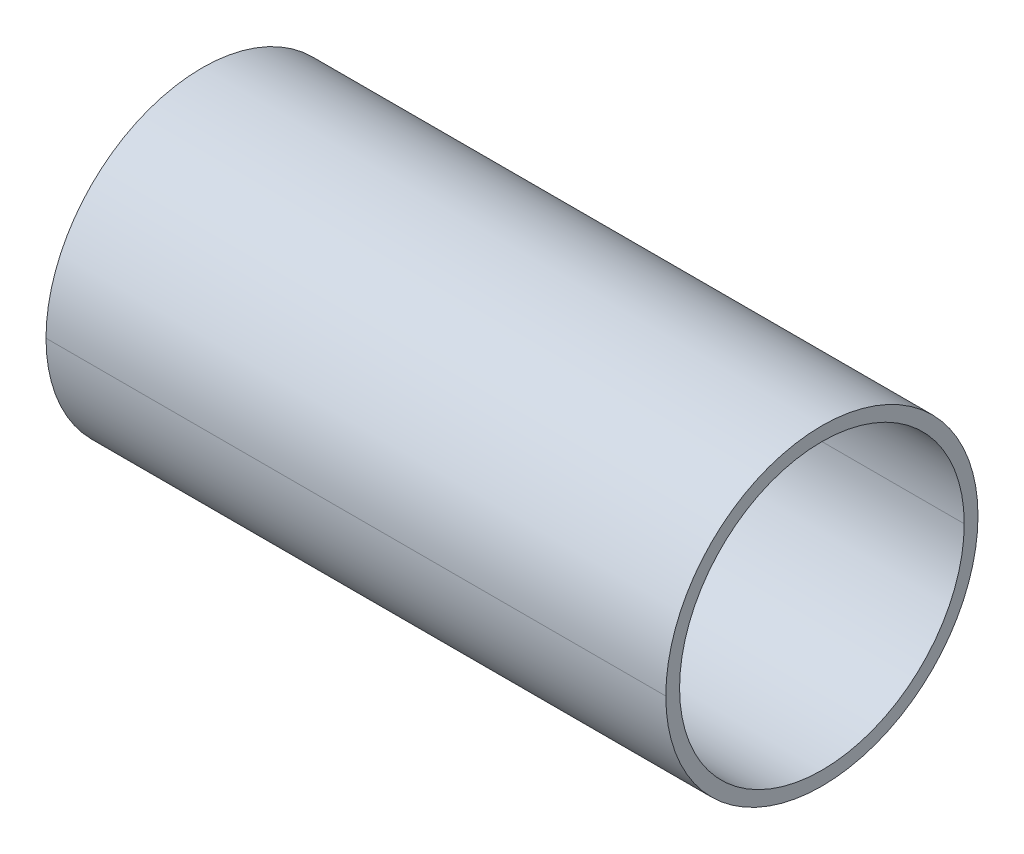
ISO-10303-21;
HEADER;
FILE_DESCRIPTION(('STEP AP214'),'2;1');
FILE_NAME('part.step','',(''),(''),'','','');
FILE_SCHEMA(('AUTOMOTIVE_DESIGN { 1 0 10303 214 1 1 1 1 }'));
ENDSEC;
DATA;
#1=APPLICATION_CONTEXT('core data for automotive mechanical design processes');
#2=APPLICATION_PROTOCOL_DEFINITION('international standard','automotive_design',2000,#1);
#3=PRODUCT_CONTEXT('',#1,'mechanical');
#4=PRODUCT('Part','Part','',(#3));
#5=PRODUCT_RELATED_PRODUCT_CATEGORY('part','',(#4));
#6=PRODUCT_DEFINITION_FORMATION('','',#4);
#7=PRODUCT_DEFINITION_CONTEXT('part definition',#1,'design');
#8=PRODUCT_DEFINITION('design','',#6,#7);
#9=PRODUCT_DEFINITION_SHAPE('','',#8);
#10=(LENGTH_UNIT() NAMED_UNIT(*) SI_UNIT(.MILLI.,.METRE.));
#11=(NAMED_UNIT(*) PLANE_ANGLE_UNIT() SI_UNIT($,.RADIAN.));
#12=(NAMED_UNIT(*) SI_UNIT($,.STERADIAN.) SOLID_ANGLE_UNIT());
#13=UNCERTAINTY_MEASURE_WITH_UNIT(LENGTH_MEASURE(1.E-05),#10,'distance_accuracy_value','');
#14=(GEOMETRIC_REPRESENTATION_CONTEXT(3) GLOBAL_UNCERTAINTY_ASSIGNED_CONTEXT((#13)) GLOBAL_UNIT_ASSIGNED_CONTEXT((#10,
#11,#12)) REPRESENTATION_CONTEXT('',''));
#15=CARTESIAN_POINT('',(0.,0.,0.));
#16=DIRECTION('',(0.,0.,1.));
#17=DIRECTION('',(1.,0.,0.));
#18=AXIS2_PLACEMENT_3D('',#15,#16,#17);
#19=CARTESIAN_POINT('',(-125.048400264241,0.,0.));
#20=DIRECTION('',(-1.,0.,0.));
#21=DIRECTION('',(0.,0.,1.));
#22=AXIS2_PLACEMENT_3D('',#19,#20,#21);
#23=CYLINDRICAL_SURFACE('',#22,34.);
#24=DIRECTION('',(-1.,0.,0.));
#25=VECTOR('',#24,1.);
#26=CARTESIAN_POINT('',(-125.048400264241,0.,-34.));
#27=LINE('',#26,#25);
#28=CARTESIAN_POINT('',(67.5,0.,-34.));
#29=VERTEX_POINT('',#28);
#30=CARTESIAN_POINT('',(-67.5,0.,-34.));
#31=VERTEX_POINT('',#30);
#32=EDGE_CURVE('E113',#29,#31,#27,.T.);
#33=ORIENTED_EDGE('',*,*,#32,.F.);
#34=CARTESIAN_POINT('',(67.5,0.,0.));
#35=DIRECTION('',(-1.,0.,0.));
#36=DIRECTION('',(0.,0.,1.));
#37=AXIS2_PLACEMENT_3D('',#34,#35,#36);
#38=CIRCLE('',#37,34.);
#39=CARTESIAN_POINT('',(67.5,0.,34.));
#40=VERTEX_POINT('',#39);
#41=EDGE_CURVE('E11',#29,#40,#38,.T.);
#42=ORIENTED_EDGE('',*,*,#41,.T.);
#43=DIRECTION('',(-1.,0.,0.));
#44=VECTOR('',#43,1.);
#45=CARTESIAN_POINT('',(-125.048400264241,0.,34.));
#46=LINE('',#45,#44);
#47=CARTESIAN_POINT('',(-67.5,0.,34.));
#48=VERTEX_POINT('',#47);
#49=EDGE_CURVE('E99',#40,#48,#46,.T.);
#50=ORIENTED_EDGE('',*,*,#49,.T.);
#51=CARTESIAN_POINT('',(-67.5,0.,0.));
#52=DIRECTION('',(-1.,0.,0.));
#53=DIRECTION('',(0.,0.,1.));
#54=AXIS2_PLACEMENT_3D('',#51,#52,#53);
#55=CIRCLE('',#54,34.);
#56=EDGE_CURVE('E65',#31,#48,#55,.T.);
#57=ORIENTED_EDGE('',*,*,#56,.F.);
#58=EDGE_LOOP('',(#33,#42,#50,#57));
#59=FACE_BOUND('',#58,.T.);
#60=ADVANCED_FACE('F16',(#59),#23,.T.);
#61=CARTESIAN_POINT('',(67.5,34.,0.));
#62=DIRECTION('',(-1.,0.,0.));
#63=DIRECTION('',(0.,0.,1.));
#64=AXIS2_PLACEMENT_3D('',#61,#62,#63);
#65=PLANE('',#64);
#66=CARTESIAN_POINT('',(67.5,0.,0.));
#67=DIRECTION('',(-1.,0.,0.));
#68=DIRECTION('',(0.,0.,1.));
#69=AXIS2_PLACEMENT_3D('',#66,#67,#68);
#70=CIRCLE('',#69,31.);
#71=CARTESIAN_POINT('',(67.5,0.,31.));
#72=VERTEX_POINT('',#71);
#73=CARTESIAN_POINT('',(67.5,0.,-31.));
#74=VERTEX_POINT('',#73);
#75=EDGE_CURVE('E26',#72,#74,#70,.T.);
#76=ORIENTED_EDGE('',*,*,#75,.T.);
#77=CARTESIAN_POINT('',(67.5,0.,0.));
#78=DIRECTION('',(-1.,0.,0.));
#79=DIRECTION('',(0.,0.,1.));
#80=AXIS2_PLACEMENT_3D('',#77,#78,#79);
#81=CIRCLE('',#80,31.);
#82=EDGE_CURVE('E20',#74,#72,#81,.T.);
#83=ORIENTED_EDGE('',*,*,#82,.T.);
#84=EDGE_LOOP('',(#76,#83));
#85=FACE_BOUND('',#84,.T.);
#86=CARTESIAN_POINT('',(67.5,0.,0.));
#87=DIRECTION('',(-1.,0.,0.));
#88=DIRECTION('',(0.,0.,1.));
#89=AXIS2_PLACEMENT_3D('',#86,#87,#88);
#90=CIRCLE('',#89,34.);
#91=EDGE_CURVE('E117',#40,#29,#90,.T.);
#92=ORIENTED_EDGE('',*,*,#91,.F.);
#93=ORIENTED_EDGE('',*,*,#41,.F.);
#94=EDGE_LOOP('',(#92,#93));
#95=FACE_BOUND('',#94,.T.);
#96=ADVANCED_FACE('F84',(#85,#95),#65,.F.);
#97=CARTESIAN_POINT('',(-125.048400264241,0.,0.));
#98=DIRECTION('',(-1.,0.,0.));
#99=DIRECTION('',(0.,0.,1.));
#100=AXIS2_PLACEMENT_3D('',#97,#98,#99);
#101=CYLINDRICAL_SURFACE('',#100,31.);
#102=DIRECTION('',(-1.,0.,0.));
#103=VECTOR('',#102,1.);
#104=CARTESIAN_POINT('',(-125.048400264241,0.,-31.));
#105=LINE('',#104,#103);
#106=CARTESIAN_POINT('',(-67.5,0.,-31.));
#107=VERTEX_POINT('',#106);
#108=EDGE_CURVE('E89',#74,#107,#105,.T.);
#109=ORIENTED_EDGE('',*,*,#108,.F.);
#110=ORIENTED_EDGE('',*,*,#75,.F.);
#111=DIRECTION('',(-1.,0.,0.));
#112=VECTOR('',#111,1.);
#113=CARTESIAN_POINT('',(-125.048400264241,0.,31.));
#114=LINE('',#113,#112);
#115=CARTESIAN_POINT('',(-67.5,0.,31.));
#116=VERTEX_POINT('',#115);
#117=EDGE_CURVE('E97',#72,#116,#114,.T.);
#118=ORIENTED_EDGE('',*,*,#117,.T.);
#119=CARTESIAN_POINT('',(-67.5,0.,0.));
#120=DIRECTION('',(-1.,0.,0.));
#121=DIRECTION('',(0.,0.,1.));
#122=AXIS2_PLACEMENT_3D('',#119,#120,#121);
#123=CIRCLE('',#122,31.);
#124=EDGE_CURVE('E39',#116,#107,#123,.T.);
#125=ORIENTED_EDGE('',*,*,#124,.T.);
#126=EDGE_LOOP('',(#109,#110,#118,#125));
#127=FACE_BOUND('',#126,.T.);
#128=ADVANCED_FACE('F90',(#127),#101,.F.);
#129=CARTESIAN_POINT('',(-67.5,34.,0.));
#130=DIRECTION('',(1.,0.,0.));
#131=DIRECTION('',(0.,1.,0.));
#132=AXIS2_PLACEMENT_3D('',#129,#130,#131);
#133=PLANE('',#132);
#134=ORIENTED_EDGE('',*,*,#124,.F.);
#135=CARTESIAN_POINT('',(-67.5,0.,0.));
#136=DIRECTION('',(-1.,0.,0.));
#137=DIRECTION('',(0.,0.,1.));
#138=AXIS2_PLACEMENT_3D('',#135,#136,#137);
#139=CIRCLE('',#138,31.);
#140=EDGE_CURVE('E94',#107,#116,#139,.T.);
#141=ORIENTED_EDGE('',*,*,#140,.F.);
#142=EDGE_LOOP('',(#134,#141));
#143=FACE_BOUND('',#142,.T.);
#144=CARTESIAN_POINT('',(-67.5,0.,0.));
#145=DIRECTION('',(-1.,0.,0.));
#146=DIRECTION('',(0.,0.,1.));
#147=AXIS2_PLACEMENT_3D('',#144,#145,#146);
#148=CIRCLE('',#147,34.);
#149=EDGE_CURVE('E104',#48,#31,#148,.T.);
#150=ORIENTED_EDGE('',*,*,#149,.T.);
#151=ORIENTED_EDGE('',*,*,#56,.T.);
#152=EDGE_LOOP('',(#150,#151));
#153=FACE_BOUND('',#152,.T.);
#154=ADVANCED_FACE('F138',(#143,#153),#133,.F.);
#155=CARTESIAN_POINT('',(-125.048400264241,0.,0.));
#156=DIRECTION('',(-1.,0.,0.));
#157=DIRECTION('',(0.,0.,1.));
#158=AXIS2_PLACEMENT_3D('',#155,#156,#157);
#159=CYLINDRICAL_SURFACE('',#158,31.);
#160=ORIENTED_EDGE('',*,*,#82,.F.);
#161=ORIENTED_EDGE('',*,*,#108,.T.);
#162=ORIENTED_EDGE('',*,*,#140,.T.);
#163=ORIENTED_EDGE('',*,*,#117,.F.);
#164=EDGE_LOOP('',(#160,#161,#162,#163));
#165=FACE_BOUND('',#164,.T.);
#166=ADVANCED_FACE('F96',(#165),#159,.F.);
#167=CARTESIAN_POINT('',(-125.048400264241,0.,0.));
#168=DIRECTION('',(-1.,0.,0.));
#169=DIRECTION('',(0.,0.,1.));
#170=AXIS2_PLACEMENT_3D('',#167,#168,#169);
#171=CYLINDRICAL_SURFACE('',#170,34.);
#172=ORIENTED_EDGE('',*,*,#91,.T.);
#173=ORIENTED_EDGE('',*,*,#32,.T.);
#174=ORIENTED_EDGE('',*,*,#149,.F.);
#175=ORIENTED_EDGE('',*,*,#49,.F.);
#176=EDGE_LOOP('',(#172,#173,#174,#175));
#177=FACE_BOUND('',#176,.T.);
#178=ADVANCED_FACE('F18',(#177),#171,.T.);
#179=CLOSED_SHELL('',(#60,#96,#128,#154,#166,#178));
#180=MANIFOLD_SOLID_BREP('B1',#179);
#181=ADVANCED_BREP_SHAPE_REPRESENTATION('',(#18,#180),#14);
#182=SHAPE_DEFINITION_REPRESENTATION(#9,#181);
ENDSEC;
END-ISO-10303-21;
